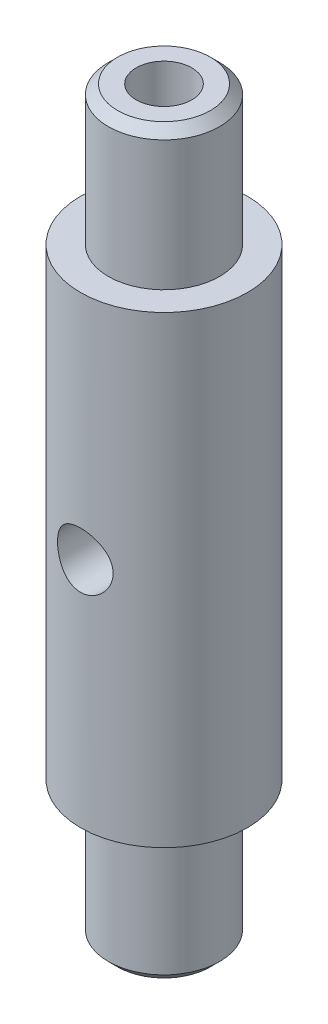
ISO-10303-21;
HEADER;
FILE_DESCRIPTION(('STEP AP214'),'2;1');
FILE_NAME('part.step','',(''),(''),'','','');
FILE_SCHEMA(('AUTOMOTIVE_DESIGN { 1 0 10303 214 1 1 1 1 }'));
ENDSEC;
DATA;
#1=APPLICATION_CONTEXT('core data for automotive mechanical design processes');
#2=APPLICATION_PROTOCOL_DEFINITION('international standard','automotive_design',2000,#1);
#3=PRODUCT_CONTEXT('',#1,'mechanical');
#4=PRODUCT('Part','Part','',(#3));
#5=PRODUCT_RELATED_PRODUCT_CATEGORY('part','',(#4));
#6=PRODUCT_DEFINITION_FORMATION('','',#4);
#7=PRODUCT_DEFINITION_CONTEXT('part definition',#1,'design');
#8=PRODUCT_DEFINITION('design','',#6,#7);
#9=PRODUCT_DEFINITION_SHAPE('','',#8);
#10=(LENGTH_UNIT() NAMED_UNIT(*) SI_UNIT(.MILLI.,.METRE.));
#11=(NAMED_UNIT(*) PLANE_ANGLE_UNIT() SI_UNIT($,.RADIAN.));
#12=(NAMED_UNIT(*) SI_UNIT($,.STERADIAN.) SOLID_ANGLE_UNIT());
#13=UNCERTAINTY_MEASURE_WITH_UNIT(LENGTH_MEASURE(1.E-05),#10,'distance_accuracy_value','');
#14=(GEOMETRIC_REPRESENTATION_CONTEXT(3) GLOBAL_UNCERTAINTY_ASSIGNED_CONTEXT((#13)) GLOBAL_UNIT_ASSIGNED_CONTEXT((#10,
#11,#12)) REPRESENTATION_CONTEXT('',''));
#15=CARTESIAN_POINT('',(0.,0.,0.));
#16=DIRECTION('',(0.,0.,1.));
#17=DIRECTION('',(1.,0.,0.));
#18=AXIS2_PLACEMENT_3D('',#15,#16,#17);
#19=CARTESIAN_POINT('',(0.,0.,-40.));
#20=DIRECTION('',(0.,0.,1.));
#21=DIRECTION('',(1.,0.,0.));
#22=AXIS2_PLACEMENT_3D('',#19,#20,#21);
#23=CYLINDRICAL_SURFACE('',#22,3.);
#24=CARTESIAN_POINT('',(3.,0.,8.48528137423857));
#25=CARTESIAN_POINT('',(3.00000077384314,-0.163404524508216,8.48528083591302));
#26=CARTESIAN_POINT('',(2.98660435105657,-0.326804399470778,8.49005307872572));
#27=CARTESIAN_POINT('',(2.93355339506643,-0.648763262982748,8.50852722243764));
#28=CARTESIAN_POINT('',(2.89389453650519,-0.807321449617408,8.52223059426566));
#29=CARTESIAN_POINT('',(2.78986645705471,-1.11488067899186,8.55684611066375));
#30=CARTESIAN_POINT('',(2.72554566420974,-1.26389978832815,8.57774411913965));
#31=CARTESIAN_POINT('',(2.57418488532414,-1.54908014564388,8.62437366030974));
#32=CARTESIAN_POINT('',(2.48713988658055,-1.68523854766089,8.65010625910837));
#33=CARTESIAN_POINT('',(2.28915343932863,-1.94615988701494,8.70463468222419));
#34=CARTESIAN_POINT('',(2.17747302413376,-2.07034628601518,8.73350684533932));
#35=CARTESIAN_POINT('',(1.93496300164318,-2.29862040367392,8.79041594403009));
#36=CARTESIAN_POINT('',(1.80413032515713,-2.40270489474711,8.81845274486885));
#37=CARTESIAN_POINT('',(1.52281352389503,-2.59043669198878,8.87141600765397));
#38=CARTESIAN_POINT('',(1.37190573367357,-2.67347991185388,8.89624223104816));
#39=CARTESIAN_POINT('',(1.05729366896242,-2.81277475538253,8.93908760312949));
#40=CARTESIAN_POINT('',(0.893592857061635,-2.86903359953072,8.95710858609006));
#41=CARTESIAN_POINT('',(0.564086452300482,-2.95120756389718,8.9837722629572));
#42=CARTESIAN_POINT('',(0.398552264558905,-2.97811033877102,8.99271944332677));
#43=CARTESIAN_POINT('',(0.0650936244722678,-3.00394888008198,9.00130824654744));
#44=CARTESIAN_POINT('',(-0.10283020063169,-3.00289185495724,9.00095226788686));
#45=CARTESIAN_POINT('',(-0.429310545581445,-2.97346723630192,8.99118118856194));
#46=CARTESIAN_POINT('',(-0.58797614577497,-2.94617241457653,8.98212194265352));
#47=CARTESIAN_POINT('',(-0.898330316466516,-2.86682105705858,8.95640902019194));
#48=CARTESIAN_POINT('',(-1.05001841333765,-2.81476284306053,8.93975482893545));
#49=CARTESIAN_POINT('',(-1.34445742452592,-2.68673604808182,8.90027010879673));
#50=CARTESIAN_POINT('',(-1.48706466290654,-2.61046218436046,8.87736127572046));
#51=CARTESIAN_POINT('',(-1.75777297658197,-2.43642088365403,8.82775179116757));
#52=CARTESIAN_POINT('',(-1.88587000315602,-2.33864747001711,8.801050086044));
#53=CARTESIAN_POINT('',(-2.13030259965392,-2.1189768196209,8.7451857554969));
#54=CARTESIAN_POINT('',(-2.24580047119582,-1.99616052647556,8.71596645506633));
#55=CARTESIAN_POINT('',(-2.45483177879452,-1.73265382282014,8.65942005746702));
#56=CARTESIAN_POINT('',(-2.54836182984463,-1.59196066281587,8.63209325236846));
#57=CARTESIAN_POINT('',(-2.71196236510723,-1.29403912318968,8.58211575363337));
#58=CARTESIAN_POINT('',(-2.78167939086402,-1.13660360604668,8.55953727854243));
#59=CARTESIAN_POINT('',(-2.89332957980801,-0.811285817356747,8.52244952473154));
#60=CARTESIAN_POINT('',(-2.93527438724248,-0.643407956381264,8.50793686461278));
#61=CARTESIAN_POINT('',(-2.98848384629256,-0.310084933765278,8.48938908946755));
#62=CARTESIAN_POINT('',(-3.0010472865229,-0.144871725754033,8.48491080956268));
#63=CARTESIAN_POINT('',(-2.99881631672916,0.185328447342319,8.48570016177553));
#64=CARTESIAN_POINT('',(-2.98402687568029,0.350315448071965,8.49096602375443));
#65=CARTESIAN_POINT('',(-2.92867695465693,0.669470897135728,8.51020854270898));
#66=CARTESIAN_POINT('',(-2.88901918194205,0.823816290452522,8.52387976322521));
#67=CARTESIAN_POINT('',(-2.7861415876814,1.12363081871755,8.55805661013069));
#68=CARTESIAN_POINT('',(-2.72291758909027,1.26909837477234,8.57856344804519));
#69=CARTESIAN_POINT('',(-2.57242302221681,1.55214126254099,8.62490632787361));
#70=CARTESIAN_POINT('',(-2.48445335507549,1.6893199279254,8.65089076996885));
#71=CARTESIAN_POINT('',(-2.28775689167268,1.94743815715116,8.70497306192896));
#72=CARTESIAN_POINT('',(-2.17902397649635,2.06837291598366,8.73307153331383));
#73=CARTESIAN_POINT('',(-1.93767511770098,2.29658395227192,8.78985115913547));
#74=CARTESIAN_POINT('',(-1.80416181163996,2.40292317005655,8.81849530733689));
#75=CARTESIAN_POINT('',(-1.52048187420077,2.59174842704413,8.87180554839326));
#76=CARTESIAN_POINT('',(-1.37031583459366,2.67423531348727,8.89647178253084));
#77=CARTESIAN_POINT('',(-1.05833958729689,2.81226031458515,8.93893217431809));
#78=CARTESIAN_POINT('',(-0.896613369963591,2.8679738314442,8.95677090013593));
#79=CARTESIAN_POINT('',(-0.56537539753805,2.95118322618031,8.98375832513324));
#80=CARTESIAN_POINT('',(-0.395866475861669,2.97868928964151,8.99291016102056));
#81=CARTESIAN_POINT('',(-0.0624460075801236,3.00378623281693,9.00125589708769));
#82=CARTESIAN_POINT('',(0.101354171760054,3.00272236179713,9.00089760268317));
#83=CARTESIAN_POINT('',(0.426333435000521,2.97402807556077,8.99136589558194));
#84=CARTESIAN_POINT('',(0.58751273045717,2.94639981554169,8.98219319800727));
#85=CARTESIAN_POINT('',(0.900126358296176,2.86625329627211,8.95622744863237));
#86=CARTESIAN_POINT('',(1.05167481273837,2.8141373539412,8.93955775083445));
#87=CARTESIAN_POINT('',(1.34393505281939,2.68686740670853,8.90031482113485));
#88=CARTESIAN_POINT('',(1.4846448724273,2.61170923440896,8.87774052144049));
#89=CARTESIAN_POINT('',(1.75690204892636,2.43729146369398,8.82797606483643));
#90=CARTESIAN_POINT('',(1.88791875467282,2.33724394385508,8.80064617475779));
#91=CARTESIAN_POINT('',(2.13174307881728,2.11722782653142,8.74478966375638));
#92=CARTESIAN_POINT('',(2.24454486487378,1.99725287321182,8.71626266319291));
#93=CARTESIAN_POINT('',(2.45322542649935,1.73517193323915,8.65989839476794));
#94=CARTESIAN_POINT('',(2.5482688979937,1.59238346707008,8.63213183965892));
#95=CARTESIAN_POINT('',(2.71294302990334,1.29199671929166,8.58180579969046));
#96=CARTESIAN_POINT('',(2.78258033045842,1.13440232091101,8.55924495483748));
#97=CARTESIAN_POINT('',(2.8915314846125,0.816114527953103,8.52304002619544));
#98=CARTESIAN_POINT('',(2.93207372744856,0.6558832094239,8.50903898571547));
#99=CARTESIAN_POINT('',(2.9863029604478,0.330431848599894,8.49016150618554));
#100=CARTESIAN_POINT('',(2.99999921758978,0.165213547767872,8.48528191852383));
#101=CARTESIAN_POINT('',(3.,0.,8.48528137423857));
#102=B_SPLINE_CURVE_WITH_KNOTS('',3,(#24,#25,#26,#27,#28,#29,#30,#31,#32,#33,#34,#35,#36,#37,
#38,#39,#40,#41,#42,#43,#44,#45,#46,#47,#48,#49,#50,#51,#52,#53,#54,#55,#56,#57,#58,#59,#60,#61,
#62,#63,#64,#65,#66,#67,#68,#69,#70,#71,#72,#73,#74,#75,#76,#77,#78,#79,#80,#81,#82,#83,#84,#85,
#86,#87,#88,#89,#90,#91,#92,#93,#94,#95,#96,#97,#98,#99,#100,#101),.UNSPECIFIED.,.T.,.F.,(4,2,2,
2,2,2,2,2,2,2,2,2,2,2,2,2,2,2,2,2,2,2,2,2,2,2,2,2,2,2,2,2,2,2,2,2,2,2,4),(0.,0.489601754398068,
0.979284165045492,1.46800988250248,1.95684349855633,2.46304012282704,2.96931795515964,
3.48880518430972,4.00815229160367,4.50942956294803,5.01057759906982,5.49207014476707,
5.9735953256771,6.46144964581005,6.94943975622066,7.46040523091753,7.97144938836318,
8.48977919529166,9.00789154069847,9.50262874093318,9.99727607511701,10.4749318730633,
10.9526723744084,11.4455657320714,11.9386045698638,12.4553642451328,12.972105562726,
13.4854137357255,13.9985364901247,14.4875425403291,14.9765089202934,15.4577086812129,
15.9389955228973,16.438065585619,16.9372951329789,17.4560670820843,17.974703348006,
18.4698963648807,18.9649184157139),.UNSPECIFIED.);
#103=CARTESIAN_POINT('',(3.,0.,8.48528137423857));
#104=VERTEX_POINT('',#103);
#105=EDGE_CURVE('E76',#104,#104,#102,.T.);
#106=ORIENTED_EDGE('',*,*,#105,.F.);
#107=EDGE_LOOP('',(#106));
#108=FACE_BOUND('',#107,.T.);
#109=CARTESIAN_POINT('',(0.,0.,0.));
#110=DIRECTION('',(0.,-0.707106781186547,0.707106781186548));
#111=DIRECTION('',(0.,0.707106781186547,0.707106781186548));
#112=AXIS2_PLACEMENT_3D('',#109,#110,#111);
#113=ELLIPSE('',#112,4.24264068711929,3.);
#114=CARTESIAN_POINT('',(-3.,0.,0.));
#115=VERTEX_POINT('',#114);
#116=CARTESIAN_POINT('',(3.,0.,0.));
#117=VERTEX_POINT('',#116);
#118=EDGE_CURVE('E53',#115,#117,#113,.F.);
#119=ORIENTED_EDGE('',*,*,#118,.T.);
#120=CARTESIAN_POINT('',(0.,0.,0.));
#121=DIRECTION('',(0.,0.707106781186547,0.707106781186548));
#122=DIRECTION('',(0.,-0.707106781186547,0.707106781186548));
#123=AXIS2_PLACEMENT_3D('',#120,#121,#122);
#124=ELLIPSE('',#123,4.24264068711929,3.);
#125=EDGE_CURVE('E11',#117,#115,#124,.F.);
#126=ORIENTED_EDGE('',*,*,#125,.T.);
#127=EDGE_LOOP('',(#119,#126));
#128=FACE_BOUND('',#127,.T.);
#129=ADVANCED_FACE('F39',(#108,#128),#23,.F.);
#130=CARTESIAN_POINT('',(0.,25.,0.));
#131=DIRECTION('',(0.,-1.,0.));
#132=DIRECTION('',(0.,0.,-1.));
#133=AXIS2_PLACEMENT_3D('',#130,#131,#132);
#134=CYLINDRICAL_SURFACE('',#133,9.);
#135=CARTESIAN_POINT('',(0.,3.,-9.));
#136=CARTESIAN_POINT('',(-0.16369008866017,3.00000076119492,-9.00000045902832));
#137=CARTESIAN_POINT('',(-0.32737558361565,2.98655920161835,-8.99549308522634));
#138=CARTESIAN_POINT('',(-0.649925282618917,2.93331267354834,-8.97795630609842));
#139=CARTESIAN_POINT('',(-0.808788984356453,2.89350496815323,-8.96492601606458));
#140=CARTESIAN_POINT('',(-1.11699836850533,2.78904226984785,-8.93175923719328));
#141=CARTESIAN_POINT('',(-1.2663594776581,2.72442881262219,-8.9116346319256));
#142=CARTESIAN_POINT('',(-1.55212481041597,2.57237648148496,-8.86633337152025));
#143=CARTESIAN_POINT('',(-1.68852647087612,2.4849331049922,-8.84115572003334));
#144=CARTESIAN_POINT('',(-1.9492250250668,2.28652258542374,-8.78742283329015));
#145=CARTESIAN_POINT('',(-2.07301110089493,2.17490629721852,-8.75878669391354));
#146=CARTESIAN_POINT('',(-2.30049807810625,1.9326985358803,-8.70180944349364));
#147=CARTESIAN_POINT('',(-2.40419455646839,1.80210289521446,-8.67346839871647));
#148=CARTESIAN_POINT('',(-2.59147482668358,1.52104465441062,-8.61939997431821));
#149=CARTESIAN_POINT('',(-2.6743945746631,1.37011878080363,-8.59377117827064));
#150=CARTESIAN_POINT('',(-2.81345662163316,1.05547171662436,-8.54925916255803));
#151=CARTESIAN_POINT('',(-2.86960709216029,0.891754448511769,-8.53037388482237));
#152=CARTESIAN_POINT('',(-2.95162038452749,0.561980335509869,-8.50233909808132));
#153=CARTESIAN_POINT('',(-2.97844034481531,0.396188374532807,-8.49288287308834));
#154=CARTESIAN_POINT('',(-3.00402337000343,0.0622087375323578,-8.48386969888523));
#155=CARTESIAN_POINT('',(-3.00279510481416,-0.105978182127571,-8.4843096906819));
#156=CARTESIAN_POINT('',(-2.97305971111026,-0.431809891332063,-8.4947704502454));
#157=CARTESIAN_POINT('',(-2.94580173950098,-0.589585208757056,-8.50435247602599));
#158=CARTESIAN_POINT('',(-2.86681848854825,-0.898180258820504,-8.53129973173653));
#159=CARTESIAN_POINT('',(-2.81509027977561,-1.04899915630521,-8.54866589352323));
#160=CARTESIAN_POINT('',(-2.68781717418063,-1.34223824877444,-8.58953733393746));
#161=CARTESIAN_POINT('',(-2.61190214612179,-1.48448407640858,-8.61313697379352));
#162=CARTESIAN_POINT('',(-2.43866731890942,-1.75461272483918,-8.66377675727179));
#163=CARTESIAN_POINT('',(-2.34134133709202,-1.88249138080014,-8.69081789371391));
#164=CARTESIAN_POINT('',(-2.12204799804671,-2.12727479448232,-8.74701987503223));
#165=CARTESIAN_POINT('',(-1.99905945022893,-2.24325808352721,-8.77621768064528));
#166=CARTESIAN_POINT('',(-1.73501870991019,-2.45319379999019,-8.8322081516111));
#167=CARTESIAN_POINT('',(-1.59396478698244,-2.54714411449349,-8.85900058614202));
#168=CARTESIAN_POINT('',(-1.2958428391388,-2.71108890070521,-8.90751323813381));
#169=CARTESIAN_POINT('',(-1.13862982924901,-2.7808364740222,-8.92918050024118));
#170=CARTESIAN_POINT('',(-0.813807250093523,-2.89260952186713,-8.96461701433304));
#171=CARTESIAN_POINT('',(-0.646201314464861,-2.93464462627031,-8.97838900964638));
#172=CARTESIAN_POINT('',(-0.313151488587912,-2.98816699806708,-8.99602881214321));
#173=CARTESIAN_POINT('',(-0.147928799594539,-3.00089942751825,-9.00030005501184));
#174=CARTESIAN_POINT('',(0.182325209880712,-2.99900197920459,-8.99966708084482));
#175=CARTESIAN_POINT('',(0.347356557958951,-2.98437672006037,-8.99476441258087));
#176=CARTESIAN_POINT('',(0.667559598912766,-2.92916427679212,-8.97660074151313));
#177=CARTESIAN_POINT('',(0.822878420504529,-2.88934138185152,-8.96358596133577));
#178=CARTESIAN_POINT('',(1.12456787573872,-2.78581966659982,-8.9307554049021));
#179=CARTESIAN_POINT('',(1.27093736552582,-2.72211780159664,-8.91093876140025));
#180=CARTESIAN_POINT('',(1.55486488917982,-2.57078870447764,-8.86586793861869));
#181=CARTESIAN_POINT('',(1.69208987765144,-2.48257622015049,-8.84048444267358));
#182=CARTESIAN_POINT('',(1.95019449040676,-2.28541754995955,-8.78715761748787));
#183=CARTESIAN_POINT('',(2.07106910338673,-2.17646503190471,-8.75921350781483));
#184=CARTESIAN_POINT('',(2.2987575234189,-1.93506374698024,-8.70230543941334));
#185=CARTESIAN_POINT('',(2.40468290773731,-1.80177231921942,-8.67335283262284));
#186=CARTESIAN_POINT('',(2.59277256697072,-1.51868529656734,-8.61899919884126));
#187=CARTESIAN_POINT('',(2.67493664379304,-1.36888956409777,-8.59359820146007));
#188=CARTESIAN_POINT('',(2.81279079124908,-1.05698095413031,-8.54947175374151));
#189=CARTESIAN_POINT('',(2.86853439649506,-0.894893762493703,-8.53073282378936));
#190=CARTESIAN_POINT('',(2.95168400027807,-0.562864049867609,-8.50232496919349));
#191=CARTESIAN_POINT('',(2.97910276486182,-0.392925103786952,-8.49265195870918));
#192=CARTESIAN_POINT('',(3.00382884743203,-0.0594087118772512,-8.48393576622531));
#193=CARTESIAN_POINT('',(3.0026107719252,0.10404702086047,-8.48437200772245));
#194=CARTESIAN_POINT('',(2.97372688034608,0.428295224766187,-8.49453809471602));
#195=CARTESIAN_POINT('',(2.94606263837576,0.589087853865265,-8.50426738708085));
#196=CARTESIAN_POINT('',(2.86611543938804,0.900406989007417,-8.53153572914675));
#197=CARTESIAN_POINT('',(2.81431003804654,1.05107047501349,-8.54892294067433));
#198=CARTESIAN_POINT('',(2.68793809727924,1.34168222081481,-8.58949196455405));
#199=CARTESIAN_POINT('',(2.61336650566142,1.48162809356402,-8.61267506290179));
#200=CARTESIAN_POINT('',(2.43978207775029,1.75345100976873,-8.66348487678139));
#201=CARTESIAN_POINT('',(2.33984472829374,1.88470950569516,-8.69126134926411));
#202=CARTESIAN_POINT('',(2.11992864940695,2.1290694401526,-8.74750068849758));
#203=CARTESIAN_POINT('',(1.99994425335445,2.24216572706422,-8.77596374737117));
#204=CARTESIAN_POINT('',(1.73772467076207,2.45143323686754,-8.83170091576632));
#205=CARTESIAN_POINT('',(1.59480454049919,2.546773043253,-8.8588854540377));
#206=CARTESIAN_POINT('',(1.29407207221987,2.71197128655194,-8.90777973517836));
#207=CARTESIAN_POINT('',(1.13626355439705,2.78183623776613,-8.9294908772379));
#208=CARTESIAN_POINT('',(0.817480941602928,2.89116489746602,-8.96416545205626));
#209=CARTESIAN_POINT('',(0.656963273029225,2.93184739879013,-8.97747637267568));
#210=CARTESIAN_POINT('',(0.33096124803074,2.98626084203138,-8.99539221192665));
#211=CARTESIAN_POINT('',(0.165478276706239,2.99999923048961,-8.99999953595715));
#212=CARTESIAN_POINT('',(0.,3.,-9.));
#213=B_SPLINE_CURVE_WITH_KNOTS('',3,(#135,#136,#137,#138,#139,#140,#141,#142,#143,#144,#145,
#146,#147,#148,#149,#150,#151,#152,#153,#154,#155,#156,#157,#158,#159,#160,#161,#162,#163,#164,
#165,#166,#167,#168,#169,#170,#171,#172,#173,#174,#175,#176,#177,#178,#179,#180,#181,#182,#183,
#184,#185,#186,#187,#188,#189,#190,#191,#192,#193,#194,#195,#196,#197,#198,#199,#200,#201,#202,
#203,#204,#205,#206,#207,#208,#209,#210,#211,#212),.UNSPECIFIED.,.T.,.F.,(4,2,2,2,2,2,2,2,2,2,2,
2,2,2,2,2,2,2,2,2,2,2,2,2,2,2,2,2,2,2,2,2,2,2,2,2,2,2,4),(0.,0.490461318078033,
0.980973555802562,1.47066801861082,1.9604591333973,2.46554052848268,2.97073299862591,
3.49045154470411,4.010011340785,4.5120577722552,5.01394901962456,5.49290479653841,
5.97191792566446,6.45864513465392,6.94551307674622,7.45779917434101,7.97013437899855,
8.48755216951073,9.00479006631625,9.49960749525509,9.99434139492529,10.4747447393464,
10.9552093585231,11.4483119953121,11.9415654246567,12.4572306864226,12.9729002470499,
13.4875204148031,14.0019085411752,14.4898699819277,14.9778023805413,15.4564676124125,
15.9352391452793,16.4349020007541,16.9347063337134,17.453989825053,17.9731404345737,
18.4690967512144,18.9649159811442),.UNSPECIFIED.);
#214=CARTESIAN_POINT('',(0.,3.,-9.));
#215=VERTEX_POINT('',#214);
#216=EDGE_CURVE('E83',#215,#215,#213,.T.);
#217=ORIENTED_EDGE('',*,*,#216,.T.);
#218=EDGE_LOOP('',(#217));
#219=FACE_BOUND('',#218,.T.);
#220=ORIENTED_EDGE('',*,*,#105,.T.);
#221=EDGE_LOOP('',(#220));
#222=FACE_BOUND('',#221,.T.);
#223=CARTESIAN_POINT('',(0.,25.,0.));
#224=DIRECTION('',(0.,1.,0.));
#225=DIRECTION('',(0.,0.,1.));
#226=AXIS2_PLACEMENT_3D('',#223,#224,#225);
#227=CIRCLE('',#226,9.);
#228=CARTESIAN_POINT('',(0.,25.,9.));
#229=VERTEX_POINT('',#228);
#230=EDGE_CURVE('E84',#229,#229,#227,.T.);
#231=ORIENTED_EDGE('',*,*,#230,.F.);
#232=EDGE_LOOP('',(#231));
#233=FACE_BOUND('',#232,.T.);
#234=CARTESIAN_POINT('',(0.,-25.,0.));
#235=DIRECTION('',(0.,1.,0.));
#236=DIRECTION('',(0.,0.,1.));
#237=AXIS2_PLACEMENT_3D('',#234,#235,#236);
#238=CIRCLE('',#237,9.);
#239=CARTESIAN_POINT('',(0.,-25.,9.));
#240=VERTEX_POINT('',#239);
#241=EDGE_CURVE('E82',#240,#240,#238,.T.);
#242=ORIENTED_EDGE('',*,*,#241,.T.);
#243=EDGE_LOOP('',(#242));
#244=FACE_BOUND('',#243,.T.);
#245=ADVANCED_FACE('F115',(#219,#222,#233,#244),#134,.T.);
#246=CARTESIAN_POINT('',(0.,25.,0.));
#247=DIRECTION('',(0.,1.,0.));
#248=DIRECTION('',(0.,0.,1.));
#249=AXIS2_PLACEMENT_3D('',#246,#247,#248);
#250=PLANE('',#249);
#251=CARTESIAN_POINT('',(0.,25.,0.));
#252=DIRECTION('',(0.,1.,0.));
#253=DIRECTION('',(0.,0.,1.));
#254=AXIS2_PLACEMENT_3D('',#251,#252,#253);
#255=CIRCLE('',#254,6.);
#256=CARTESIAN_POINT('',(0.,25.,6.));
#257=VERTEX_POINT('',#256);
#258=EDGE_CURVE('E79',#257,#257,#255,.F.);
#259=ORIENTED_EDGE('',*,*,#258,.T.);
#260=EDGE_LOOP('',(#259));
#261=FACE_BOUND('',#260,.T.);
#262=ORIENTED_EDGE('',*,*,#230,.T.);
#263=EDGE_LOOP('',(#262));
#264=FACE_BOUND('',#263,.T.);
#265=ADVANCED_FACE('F141',(#261,#264),#250,.T.);
#266=CARTESIAN_POINT('',(0.,-25.,0.));
#267=DIRECTION('',(0.,1.,0.));
#268=DIRECTION('',(0.,0.,1.));
#269=AXIS2_PLACEMENT_3D('',#266,#267,#268);
#270=PLANE('',#269);
#271=CARTESIAN_POINT('',(0.,-25.,0.));
#272=DIRECTION('',(0.,1.,0.));
#273=DIRECTION('',(0.,0.,1.));
#274=AXIS2_PLACEMENT_3D('',#271,#272,#273);
#275=CIRCLE('',#274,6.);
#276=CARTESIAN_POINT('',(0.,-25.,6.));
#277=VERTEX_POINT('',#276);
#278=EDGE_CURVE('E87',#277,#277,#275,.F.);
#279=ORIENTED_EDGE('',*,*,#278,.F.);
#280=EDGE_LOOP('',(#279));
#281=FACE_BOUND('',#280,.T.);
#282=ORIENTED_EDGE('',*,*,#241,.F.);
#283=EDGE_LOOP('',(#282));
#284=FACE_BOUND('',#283,.T.);
#285=ADVANCED_FACE('F136',(#281,#284),#270,.F.);
#286=CARTESIAN_POINT('',(0.,-40.,0.));
#287=DIRECTION('',(0.,1.,0.));
#288=DIRECTION('',(0.,0.,1.));
#289=AXIS2_PLACEMENT_3D('',#286,#287,#288);
#290=PLANE('',#289);
#291=CARTESIAN_POINT('',(0.,-40.,0.));
#292=DIRECTION('',(0.,1.,0.));
#293=DIRECTION('',(0.,0.,1.));
#294=AXIS2_PLACEMENT_3D('',#291,#292,#293);
#295=CIRCLE('',#294,4.99999999999998);
#296=CARTESIAN_POINT('',(0.,-40.,4.99999999999998));
#297=VERTEX_POINT('',#296);
#298=EDGE_CURVE('E95',#297,#297,#295,.F.);
#299=ORIENTED_EDGE('',*,*,#298,.T.);
#300=EDGE_LOOP('',(#299));
#301=FACE_BOUND('',#300,.T.);
#302=ADVANCED_FACE('F132',(#301),#290,.F.);
#303=CARTESIAN_POINT('',(0.,40.,0.));
#304=DIRECTION('',(0.,-1.,0.));
#305=DIRECTION('',(0.,0.,-1.));
#306=AXIS2_PLACEMENT_3D('',#303,#304,#305);
#307=CYLINDRICAL_SURFACE('',#306,6.);
#308=CARTESIAN_POINT('',(0.,-39.,0.));
#309=DIRECTION('',(0.,1.,0.));
#310=DIRECTION('',(0.,0.,1.));
#311=AXIS2_PLACEMENT_3D('',#308,#309,#310);
#312=CIRCLE('',#311,6.);
#313=CARTESIAN_POINT('',(0.,-39.,6.));
#314=VERTEX_POINT('',#313);
#315=EDGE_CURVE('E92',#314,#314,#312,.T.);
#316=ORIENTED_EDGE('',*,*,#315,.T.);
#317=EDGE_LOOP('',(#316));
#318=FACE_BOUND('',#317,.T.);
#319=ORIENTED_EDGE('',*,*,#278,.T.);
#320=EDGE_LOOP('',(#319));
#321=FACE_BOUND('',#320,.T.);
#322=ADVANCED_FACE('F135',(#318,#321),#307,.T.);
#323=CARTESIAN_POINT('',(0.,39.,0.));
#324=DIRECTION('',(0.,1.,0.));
#325=DIRECTION('',(0.,0.,1.));
#326=AXIS2_PLACEMENT_3D('',#323,#324,#325);
#327=CIRCLE('',#326,6.);
#328=CARTESIAN_POINT('',(0.,39.,6.));
#329=VERTEX_POINT('',#328);
#330=EDGE_CURVE('E101',#329,#329,#327,.F.);
#331=ORIENTED_EDGE('',*,*,#330,.T.);
#332=EDGE_LOOP('',(#331));
#333=FACE_BOUND('',#332,.T.);
#334=ORIENTED_EDGE('',*,*,#258,.F.);
#335=EDGE_LOOP('',(#334));
#336=FACE_BOUND('',#335,.T.);
#337=ADVANCED_FACE('F130',(#333,#336),#307,.T.);
#338=CARTESIAN_POINT('',(0.,40.,0.));
#339=DIRECTION('',(0.,1.,0.));
#340=DIRECTION('',(0.,0.,1.));
#341=AXIS2_PLACEMENT_3D('',#338,#339,#340);
#342=PLANE('',#341);
#343=CARTESIAN_POINT('',(0.,40.,0.));
#344=DIRECTION('',(0.,1.,0.));
#345=DIRECTION('',(0.,0.,1.));
#346=AXIS2_PLACEMENT_3D('',#343,#344,#345);
#347=CIRCLE('',#346,3.);
#348=CARTESIAN_POINT('',(0.,40.,3.));
#349=VERTEX_POINT('',#348);
#350=EDGE_CURVE('E73',#349,#349,#347,.T.);
#351=ORIENTED_EDGE('',*,*,#350,.F.);
#352=EDGE_LOOP('',(#351));
#353=FACE_BOUND('',#352,.T.);
#354=CARTESIAN_POINT('',(0.,40.,0.));
#355=DIRECTION('',(0.,1.,0.));
#356=DIRECTION('',(0.,0.,1.));
#357=AXIS2_PLACEMENT_3D('',#354,#355,#356);
#358=CIRCLE('',#357,4.99999999999998);
#359=CARTESIAN_POINT('',(0.,40.,4.99999999999998));
#360=VERTEX_POINT('',#359);
#361=EDGE_CURVE('E98',#360,#360,#358,.T.);
#362=ORIENTED_EDGE('',*,*,#361,.T.);
#363=EDGE_LOOP('',(#362));
#364=FACE_BOUND('',#363,.T.);
#365=ADVANCED_FACE('F125',(#353,#364),#342,.T.);
#366=CARTESIAN_POINT('',(0.,-39.,0.));
#367=DIRECTION('',(0.,1.,0.));
#368=DIRECTION('',(0.,0.,1.));
#369=AXIS2_PLACEMENT_3D('',#366,#367,#368);
#370=CONICAL_SURFACE('',#369,6.,0.785398163397453);
#371=ORIENTED_EDGE('',*,*,#298,.F.);
#372=EDGE_LOOP('',(#371));
#373=FACE_BOUND('',#372,.T.);
#374=ORIENTED_EDGE('',*,*,#315,.F.);
#375=EDGE_LOOP('',(#374));
#376=FACE_BOUND('',#375,.T.);
#377=ADVANCED_FACE('F129',(#373,#376),#370,.T.);
#378=CARTESIAN_POINT('',(0.,40.,0.));
#379=DIRECTION('',(0.,-1.,0.));
#380=DIRECTION('',(0.,0.,-1.));
#381=AXIS2_PLACEMENT_3D('',#378,#379,#380);
#382=CONICAL_SURFACE('',#381,4.99999999999998,0.78539816339745);
#383=ORIENTED_EDGE('',*,*,#330,.F.);
#384=EDGE_LOOP('',(#383));
#385=FACE_BOUND('',#384,.T.);
#386=ORIENTED_EDGE('',*,*,#361,.F.);
#387=EDGE_LOOP('',(#386));
#388=FACE_BOUND('',#387,.T.);
#389=ADVANCED_FACE('F42',(#385,#388),#382,.T.);
#390=CARTESIAN_POINT('',(0.,0.,0.));
#391=DIRECTION('',(0.,-0.707106781186547,0.707106781186548));
#392=DIRECTION('',(0.,0.707106781186547,0.707106781186548));
#393=AXIS2_PLACEMENT_3D('',#390,#391,#392);
#394=ELLIPSE('',#393,4.24264068711929,3.);
#395=EDGE_CURVE('E60',#115,#117,#394,.T.);
#396=ORIENTED_EDGE('',*,*,#395,.T.);
#397=CARTESIAN_POINT('',(0.,0.,0.));
#398=DIRECTION('',(0.,0.707106781186547,0.707106781186548));
#399=DIRECTION('',(0.,-0.707106781186547,0.707106781186548));
#400=AXIS2_PLACEMENT_3D('',#397,#398,#399);
#401=ELLIPSE('',#400,4.24264068711929,3.);
#402=EDGE_CURVE('E48',#117,#115,#401,.T.);
#403=ORIENTED_EDGE('',*,*,#402,.T.);
#404=EDGE_LOOP('',(#396,#403));
#405=FACE_BOUND('',#404,.T.);
#406=ORIENTED_EDGE('',*,*,#216,.F.);
#407=EDGE_LOOP('',(#406));
#408=FACE_BOUND('',#407,.T.);
#409=ADVANCED_FACE('F118',(#405,#408),#23,.F.);
#410=CARTESIAN_POINT('',(0.,-5.,0.));
#411=DIRECTION('',(0.,1.,0.));
#412=DIRECTION('',(0.,0.,1.));
#413=AXIS2_PLACEMENT_3D('',#410,#411,#412);
#414=CYLINDRICAL_SURFACE('',#413,3.);
#415=ORIENTED_EDGE('',*,*,#350,.T.);
#416=EDGE_LOOP('',(#415));
#417=FACE_BOUND('',#416,.T.);
#418=ORIENTED_EDGE('',*,*,#118,.F.);
#419=ORIENTED_EDGE('',*,*,#402,.F.);
#420=EDGE_LOOP('',(#418,#419));
#421=FACE_BOUND('',#420,.T.);
#422=ADVANCED_FACE('F123',(#417,#421),#414,.F.);
#423=CARTESIAN_POINT('',(0.,-5.,0.));
#424=DIRECTION('',(0.,1.,0.));
#425=DIRECTION('',(0.,0.,1.));
#426=AXIS2_PLACEMENT_3D('',#423,#424,#425);
#427=CIRCLE('',#426,3.);
#428=CARTESIAN_POINT('',(0.,-5.,3.));
#429=VERTEX_POINT('',#428);
#430=EDGE_CURVE('E71',#429,#429,#427,.T.);
#431=ORIENTED_EDGE('',*,*,#430,.F.);
#432=EDGE_LOOP('',(#431));
#433=FACE_BOUND('',#432,.T.);
#434=ORIENTED_EDGE('',*,*,#395,.F.);
#435=ORIENTED_EDGE('',*,*,#125,.F.);
#436=EDGE_LOOP('',(#434,#435));
#437=FACE_BOUND('',#436,.T.);
#438=ADVANCED_FACE('F67',(#433,#437),#414,.F.);
#439=CARTESIAN_POINT('',(0.,-5.,0.));
#440=DIRECTION('',(0.,1.,0.));
#441=DIRECTION('',(0.,0.,1.));
#442=AXIS2_PLACEMENT_3D('',#439,#440,#441);
#443=CONICAL_SURFACE('',#442,3.,1.0471975511966);
#444=CARTESIAN_POINT('',(0.,-6.73205080756887,0.));
#445=VERTEX_POINT('',#444);
#446=VERTEX_LOOP('',#445);
#447=FACE_BOUND('',#446,.T.);
#448=ORIENTED_EDGE('',*,*,#430,.T.);
#449=EDGE_LOOP('',(#448));
#450=FACE_BOUND('',#449,.T.);
#451=ADVANCED_FACE('F64',(#447,#450),#443,.F.);
#452=CLOSED_SHELL('',(#129,#245,#265,#285,#302,#322,#337,#365,#377,#389,#409,#422,#438,#451));
#453=MANIFOLD_SOLID_BREP('B2',#452);
#454=ADVANCED_BREP_SHAPE_REPRESENTATION('',(#18,#453),#14);
#455=SHAPE_DEFINITION_REPRESENTATION(#9,#454);
ENDSEC;
END-ISO-10303-21;
